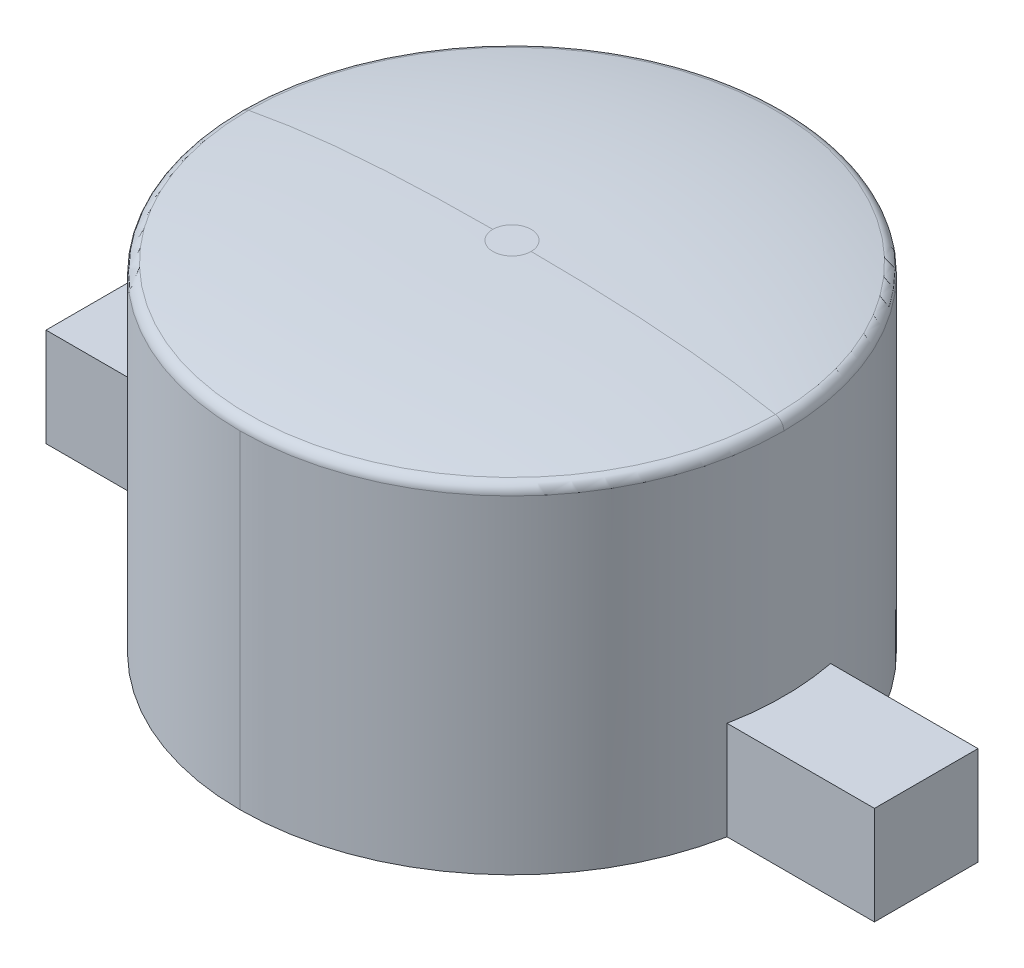
ISO-10303-21;
HEADER;
FILE_DESCRIPTION(('STEP AP214'),'2;1');
FILE_NAME('part.step','',(''),(''),'','','');
FILE_SCHEMA(('AUTOMOTIVE_DESIGN { 1 0 10303 214 1 1 1 1 }'));
ENDSEC;
DATA;
#1=APPLICATION_CONTEXT('core data for automotive mechanical design processes');
#2=APPLICATION_PROTOCOL_DEFINITION('international standard','automotive_design',2000,#1);
#3=PRODUCT_CONTEXT('',#1,'mechanical');
#4=PRODUCT('Part','Part','',(#3));
#5=PRODUCT_RELATED_PRODUCT_CATEGORY('part','',(#4));
#6=PRODUCT_DEFINITION_FORMATION('','',#4);
#7=PRODUCT_DEFINITION_CONTEXT('part definition',#1,'design');
#8=PRODUCT_DEFINITION('design','',#6,#7);
#9=PRODUCT_DEFINITION_SHAPE('','',#8);
#10=(LENGTH_UNIT() NAMED_UNIT(*) SI_UNIT(.MILLI.,.METRE.));
#11=(NAMED_UNIT(*) PLANE_ANGLE_UNIT() SI_UNIT($,.RADIAN.));
#12=(NAMED_UNIT(*) SI_UNIT($,.STERADIAN.) SOLID_ANGLE_UNIT());
#13=UNCERTAINTY_MEASURE_WITH_UNIT(LENGTH_MEASURE(1.E-05),#10,'distance_accuracy_value','');
#14=(GEOMETRIC_REPRESENTATION_CONTEXT(3) GLOBAL_UNCERTAINTY_ASSIGNED_CONTEXT((#13)) GLOBAL_UNIT_ASSIGNED_CONTEXT((#10,
#11,#12)) REPRESENTATION_CONTEXT('',''));
#15=CARTESIAN_POINT('',(0.,0.,0.));
#16=DIRECTION('',(0.,0.,1.));
#17=DIRECTION('',(1.,0.,0.));
#18=AXIS2_PLACEMENT_3D('',#15,#16,#17);
#19=CARTESIAN_POINT('',(0.,5.2,0.));
#20=DIRECTION('',(0.,1.,0.));
#21=DIRECTION('',(1.,0.,0.));
#22=AXIS2_PLACEMENT_3D('',#19,#20,#21);
#23=PLANE('',#22);
#24=CARTESIAN_POINT('',(0.,5.2,0.));
#25=DIRECTION('',(0.,-1.,0.));
#26=DIRECTION('',(0.,0.,-1.));
#27=AXIS2_PLACEMENT_3D('',#24,#25,#26);
#28=CIRCLE('',#27,0.95);
#29=CARTESIAN_POINT('',(0.,5.2,0.95));
#30=VERTEX_POINT('',#29);
#31=CARTESIAN_POINT('',(0.,5.2,-0.95));
#32=VERTEX_POINT('',#31);
#33=EDGE_CURVE('E471',#30,#32,#28,.T.);
#34=ORIENTED_EDGE('',*,*,#33,.T.);
#35=CARTESIAN_POINT('',(0.,5.2,0.));
#36=DIRECTION('',(0.,-1.,0.));
#37=DIRECTION('',(0.,0.,-1.));
#38=AXIS2_PLACEMENT_3D('',#35,#36,#37);
#39=CIRCLE('',#38,0.95);
#40=EDGE_CURVE('E11',#32,#30,#39,.T.);
#41=ORIENTED_EDGE('',*,*,#40,.T.);
#42=EDGE_LOOP('',(#34,#41));
#43=FACE_BOUND('',#42,.T.);
#44=ADVANCED_FACE('F17',(#43),#23,.F.);
#45=CARTESIAN_POINT('',(0.,2.5,0.));
#46=DIRECTION('',(0.,-1.,0.));
#47=DIRECTION('',(0.,0.,-1.));
#48=AXIS2_PLACEMENT_3D('',#45,#46,#47);
#49=PLANE('',#48);
#50=CARTESIAN_POINT('',(0.,2.5,0.));
#51=DIRECTION('',(0.,-1.,0.));
#52=DIRECTION('',(0.,0.,-1.));
#53=AXIS2_PLACEMENT_3D('',#50,#51,#52);
#54=CIRCLE('',#53,0.95);
#55=CARTESIAN_POINT('',(0.,2.5,0.95));
#56=VERTEX_POINT('',#55);
#57=CARTESIAN_POINT('',(0.,2.5,-0.95));
#58=VERTEX_POINT('',#57);
#59=EDGE_CURVE('E523',#56,#58,#54,.T.);
#60=ORIENTED_EDGE('',*,*,#59,.F.);
#61=CARTESIAN_POINT('',(0.,2.5,0.));
#62=DIRECTION('',(0.,-1.,0.));
#63=DIRECTION('',(0.,0.,-1.));
#64=AXIS2_PLACEMENT_3D('',#61,#62,#63);
#65=CIRCLE('',#64,0.95);
#66=EDGE_CURVE('E28',#58,#56,#65,.T.);
#67=ORIENTED_EDGE('',*,*,#66,.F.);
#68=EDGE_LOOP('',(#60,#67));
#69=FACE_BOUND('',#68,.T.);
#70=DIRECTION('',(1.,0.,0.));
#71=VECTOR('',#70,1.);
#72=CARTESIAN_POINT('',(0.,2.5,0.4));
#73=LINE('',#72,#71);
#74=CARTESIAN_POINT('',(1.95959179422654,2.5,0.4));
#75=VERTEX_POINT('',#74);
#76=CARTESIAN_POINT('',(3.62801598673435,2.5,0.4));
#77=VERTEX_POINT('',#76);
#78=EDGE_CURVE('E402',#75,#77,#73,.T.);
#79=ORIENTED_EDGE('',*,*,#78,.F.);
#80=CARTESIAN_POINT('',(0.,2.5,0.));
#81=DIRECTION('',(0.,-1.,0.));
#82=DIRECTION('',(0.,0.,-1.));
#83=AXIS2_PLACEMENT_3D('',#80,#81,#82);
#84=CIRCLE('',#83,2.);
#85=CARTESIAN_POINT('',(0.,2.5,2.));
#86=VERTEX_POINT('',#85);
#87=EDGE_CURVE('E406',#75,#86,#84,.T.);
#88=ORIENTED_EDGE('',*,*,#87,.T.);
#89=CARTESIAN_POINT('',(0.,2.5,0.));
#90=DIRECTION('',(0.,-1.,0.));
#91=DIRECTION('',(0.,0.,-1.));
#92=AXIS2_PLACEMENT_3D('',#89,#90,#91);
#93=CIRCLE('',#92,2.);
#94=CARTESIAN_POINT('',(-1.95959179422654,2.5,0.4));
#95=VERTEX_POINT('',#94);
#96=EDGE_CURVE('E522',#86,#95,#93,.T.);
#97=ORIENTED_EDGE('',*,*,#96,.T.);
#98=DIRECTION('',(1.,0.,0.));
#99=VECTOR('',#98,1.);
#100=CARTESIAN_POINT('',(0.,2.5,0.4));
#101=LINE('',#100,#99);
#102=CARTESIAN_POINT('',(-3.62801598673435,2.5,0.4));
#103=VERTEX_POINT('',#102);
#104=EDGE_CURVE('E340',#103,#95,#101,.T.);
#105=ORIENTED_EDGE('',*,*,#104,.F.);
#106=CARTESIAN_POINT('',(0.,2.5,0.));
#107=DIRECTION('',(0.,-1.,0.));
#108=DIRECTION('',(0.,0.,-1.));
#109=AXIS2_PLACEMENT_3D('',#106,#107,#108);
#110=CIRCLE('',#109,3.65);
#111=CARTESIAN_POINT('',(-3.62801598673435,2.5,-0.4));
#112=VERTEX_POINT('',#111);
#113=EDGE_CURVE('E433',#103,#112,#110,.T.);
#114=ORIENTED_EDGE('',*,*,#113,.T.);
#115=DIRECTION('',(1.,0.,0.));
#116=VECTOR('',#115,1.);
#117=CARTESIAN_POINT('',(0.,2.5,-0.4));
#118=LINE('',#117,#116);
#119=CARTESIAN_POINT('',(-1.95959179422654,2.5,-0.4));
#120=VERTEX_POINT('',#119);
#121=EDGE_CURVE('E339',#112,#120,#118,.T.);
#122=ORIENTED_EDGE('',*,*,#121,.T.);
#123=CARTESIAN_POINT('',(0.,2.5,0.));
#124=DIRECTION('',(0.,-1.,0.));
#125=DIRECTION('',(0.,0.,-1.));
#126=AXIS2_PLACEMENT_3D('',#123,#124,#125);
#127=CIRCLE('',#126,2.);
#128=CARTESIAN_POINT('',(-0.4,2.5,-1.95959179422654));
#129=VERTEX_POINT('',#128);
#130=EDGE_CURVE('E106',#120,#129,#127,.T.);
#131=ORIENTED_EDGE('',*,*,#130,.T.);
#132=DIRECTION('',(0.,0.,-1.));
#133=VECTOR('',#132,1.);
#134=CARTESIAN_POINT('',(-0.4,2.5,0.));
#135=LINE('',#134,#133);
#136=CARTESIAN_POINT('',(-0.4,2.5,-3.62801598673435));
#137=VERTEX_POINT('',#136);
#138=EDGE_CURVE('E93',#129,#137,#135,.T.);
#139=ORIENTED_EDGE('',*,*,#138,.T.);
#140=CARTESIAN_POINT('',(0.,2.5,0.));
#141=DIRECTION('',(0.,-1.,0.));
#142=DIRECTION('',(0.,0.,-1.));
#143=AXIS2_PLACEMENT_3D('',#140,#141,#142);
#144=CIRCLE('',#143,3.65);
#145=CARTESIAN_POINT('',(0.,2.5,-3.65));
#146=VERTEX_POINT('',#145);
#147=EDGE_CURVE('E297',#137,#146,#144,.T.);
#148=ORIENTED_EDGE('',*,*,#147,.T.);
#149=CARTESIAN_POINT('',(0.,2.5,0.));
#150=DIRECTION('',(0.,-1.,0.));
#151=DIRECTION('',(0.,0.,-1.));
#152=AXIS2_PLACEMENT_3D('',#149,#150,#151);
#153=CIRCLE('',#152,3.65);
#154=CARTESIAN_POINT('',(0.4,2.5,-3.62801598673435));
#155=VERTEX_POINT('',#154);
#156=EDGE_CURVE('E286',#146,#155,#153,.T.);
#157=ORIENTED_EDGE('',*,*,#156,.T.);
#158=DIRECTION('',(0.,0.,-1.));
#159=VECTOR('',#158,1.);
#160=CARTESIAN_POINT('',(0.4,2.5,0.));
#161=LINE('',#160,#159);
#162=CARTESIAN_POINT('',(0.4,2.5,-1.95959179422654));
#163=VERTEX_POINT('',#162);
#164=EDGE_CURVE('E351',#163,#155,#161,.T.);
#165=ORIENTED_EDGE('',*,*,#164,.F.);
#166=CARTESIAN_POINT('',(0.,2.5,0.));
#167=DIRECTION('',(0.,-1.,0.));
#168=DIRECTION('',(0.,0.,-1.));
#169=AXIS2_PLACEMENT_3D('',#166,#167,#168);
#170=CIRCLE('',#169,2.);
#171=CARTESIAN_POINT('',(1.95959179422654,2.5,-0.4));
#172=VERTEX_POINT('',#171);
#173=EDGE_CURVE('E21',#163,#172,#170,.T.);
#174=ORIENTED_EDGE('',*,*,#173,.T.);
#175=DIRECTION('',(1.,0.,0.));
#176=VECTOR('',#175,1.);
#177=CARTESIAN_POINT('',(0.,2.5,-0.4));
#178=LINE('',#177,#176);
#179=CARTESIAN_POINT('',(3.62801598673435,2.5,-0.4));
#180=VERTEX_POINT('',#179);
#181=EDGE_CURVE('E43',#172,#180,#178,.T.);
#182=ORIENTED_EDGE('',*,*,#181,.T.);
#183=CARTESIAN_POINT('',(0.,2.5,0.));
#184=DIRECTION('',(0.,-1.,0.));
#185=DIRECTION('',(0.,0.,-1.));
#186=AXIS2_PLACEMENT_3D('',#183,#184,#185);
#187=CIRCLE('',#186,3.65);
#188=EDGE_CURVE('E362',#180,#77,#187,.T.);
#189=ORIENTED_EDGE('',*,*,#188,.T.);
#190=EDGE_LOOP('',(#79,#88,#97,#105,#114,#122,#131,#139,#148,#157,#165,#174,#182,#189));
#191=FACE_BOUND('',#190,.T.);
#192=ADVANCED_FACE('F597',(#69,#191),#49,.T.);
#193=CARTESIAN_POINT('',(0.,2.5,0.));
#194=DIRECTION('',(0.,1.,0.));
#195=DIRECTION('',(0.,0.,1.));
#196=AXIS2_PLACEMENT_3D('',#193,#194,#195);
#197=CYLINDRICAL_SURFACE('',#196,0.95);
#198=DIRECTION('',(0.,1.,0.));
#199=VECTOR('',#198,1.);
#200=CARTESIAN_POINT('',(0.,2.5,-0.95));
#201=LINE('',#200,#199);
#202=EDGE_CURVE('E478',#58,#32,#201,.T.);
#203=ORIENTED_EDGE('',*,*,#202,.F.);
#204=ORIENTED_EDGE('',*,*,#66,.T.);
#205=DIRECTION('',(0.,1.,0.));
#206=VECTOR('',#205,1.);
#207=CARTESIAN_POINT('',(0.,2.5,0.95));
#208=LINE('',#207,#206);
#209=EDGE_CURVE('E477',#56,#30,#208,.T.);
#210=ORIENTED_EDGE('',*,*,#209,.T.);
#211=ORIENTED_EDGE('',*,*,#40,.F.);
#212=EDGE_LOOP('',(#203,#204,#210,#211));
#213=FACE_BOUND('',#212,.T.);
#214=ADVANCED_FACE('F687',(#213),#197,.F.);
#215=CARTESIAN_POINT('',(0.,2.5,-0.4));
#216=DIRECTION('',(0.,0.,1.));
#217=DIRECTION('',(1.,0.,0.));
#218=AXIS2_PLACEMENT_3D('',#215,#216,#217);
#219=PLANE('',#218);
#220=DIRECTION('',(1.,0.,0.));
#221=VECTOR('',#220,1.);
#222=CARTESIAN_POINT('',(0.,5.2,-0.4));
#223=LINE('',#222,#221);
#224=CARTESIAN_POINT('',(1.95959179422654,5.2,-0.4));
#225=VERTEX_POINT('',#224);
#226=CARTESIAN_POINT('',(3.62801598673435,5.2,-0.4));
#227=VERTEX_POINT('',#226);
#228=EDGE_CURVE('E418',#225,#227,#223,.T.);
#229=ORIENTED_EDGE('',*,*,#228,.T.);
#230=DIRECTION('',(0.,1.,0.));
#231=VECTOR('',#230,1.);
#232=CARTESIAN_POINT('',(3.62801598673435,2.5,-0.4));
#233=LINE('',#232,#231);
#234=EDGE_CURVE('E357',#180,#227,#233,.T.);
#235=ORIENTED_EDGE('',*,*,#234,.F.);
#236=ORIENTED_EDGE('',*,*,#181,.F.);
#237=DIRECTION('',(0.,1.,0.));
#238=VECTOR('',#237,1.);
#239=CARTESIAN_POINT('',(1.95959179422654,2.5,-0.4));
#240=LINE('',#239,#238);
#241=EDGE_CURVE('E363',#172,#225,#240,.T.);
#242=ORIENTED_EDGE('',*,*,#241,.T.);
#243=EDGE_LOOP('',(#229,#235,#236,#242));
#244=FACE_BOUND('',#243,.T.);
#245=ADVANCED_FACE('F657',(#244),#219,.F.);
#246=CARTESIAN_POINT('',(0.,2.5,0.));
#247=DIRECTION('',(0.,1.,0.));
#248=DIRECTION('',(0.,0.,1.));
#249=AXIS2_PLACEMENT_3D('',#246,#247,#248);
#250=CYLINDRICAL_SURFACE('',#249,2.);
#251=CARTESIAN_POINT('',(0.,5.2,0.));
#252=DIRECTION('',(0.,-1.,0.));
#253=DIRECTION('',(0.,0.,-1.));
#254=AXIS2_PLACEMENT_3D('',#251,#252,#253);
#255=CIRCLE('',#254,2.);
#256=CARTESIAN_POINT('',(0.4,5.2,-1.95959179422654));
#257=VERTEX_POINT('',#256);
#258=EDGE_CURVE('E428',#257,#225,#255,.T.);
#259=ORIENTED_EDGE('',*,*,#258,.T.);
#260=ORIENTED_EDGE('',*,*,#241,.F.);
#261=ORIENTED_EDGE('',*,*,#173,.F.);
#262=DIRECTION('',(0.,1.,0.));
#263=VECTOR('',#262,1.);
#264=CARTESIAN_POINT('',(0.4,2.5,-1.95959179422654));
#265=LINE('',#264,#263);
#266=EDGE_CURVE('E348',#163,#257,#265,.T.);
#267=ORIENTED_EDGE('',*,*,#266,.T.);
#268=EDGE_LOOP('',(#259,#260,#261,#267));
#269=FACE_BOUND('',#268,.T.);
#270=ADVANCED_FACE('F1067',(#269),#250,.T.);
#271=CARTESIAN_POINT('',(0.4,2.5,0.));
#272=DIRECTION('',(1.,0.,0.));
#273=DIRECTION('',(0.,0.,1.));
#274=AXIS2_PLACEMENT_3D('',#271,#272,#273);
#275=PLANE('',#274);
#276=DIRECTION('',(0.,0.,-1.));
#277=VECTOR('',#276,1.);
#278=CARTESIAN_POINT('',(0.4,5.2,0.));
#279=LINE('',#278,#277);
#280=CARTESIAN_POINT('',(0.4,5.2,-3.62801598673435));
#281=VERTEX_POINT('',#280);
#282=EDGE_CURVE('E425',#257,#281,#279,.T.);
#283=ORIENTED_EDGE('',*,*,#282,.F.);
#284=ORIENTED_EDGE('',*,*,#266,.F.);
#285=ORIENTED_EDGE('',*,*,#164,.T.);
#286=DIRECTION('',(0.,1.,0.));
#287=VECTOR('',#286,1.);
#288=CARTESIAN_POINT('',(0.4,2.5,-3.62801598673435));
#289=LINE('',#288,#287);
#290=EDGE_CURVE('E385',#155,#281,#289,.T.);
#291=ORIENTED_EDGE('',*,*,#290,.T.);
#292=EDGE_LOOP('',(#283,#284,#285,#291));
#293=FACE_BOUND('',#292,.T.);
#294=ADVANCED_FACE('F666',(#293),#275,.T.);
#295=CARTESIAN_POINT('',(-0.4,2.5,0.));
#296=DIRECTION('',(1.,0.,0.));
#297=DIRECTION('',(0.,0.,1.));
#298=AXIS2_PLACEMENT_3D('',#295,#296,#297);
#299=PLANE('',#298);
#300=DIRECTION('',(0.,0.,-1.));
#301=VECTOR('',#300,1.);
#302=CARTESIAN_POINT('',(-0.4,5.2,0.));
#303=LINE('',#302,#301);
#304=CARTESIAN_POINT('',(-0.4,5.2,-1.95959179422654));
#305=VERTEX_POINT('',#304);
#306=CARTESIAN_POINT('',(-0.4,5.2,-3.62801598673435));
#307=VERTEX_POINT('',#306);
#308=EDGE_CURVE('E394',#305,#307,#303,.T.);
#309=ORIENTED_EDGE('',*,*,#308,.T.);
#310=DIRECTION('',(0.,1.,0.));
#311=VECTOR('',#310,1.);
#312=CARTESIAN_POINT('',(-0.4,2.5,-3.62801598673435));
#313=LINE('',#312,#311);
#314=EDGE_CURVE('E325',#137,#307,#313,.T.);
#315=ORIENTED_EDGE('',*,*,#314,.F.);
#316=ORIENTED_EDGE('',*,*,#138,.F.);
#317=DIRECTION('',(0.,1.,0.));
#318=VECTOR('',#317,1.);
#319=CARTESIAN_POINT('',(-0.4,2.5,-1.95959179422654));
#320=LINE('',#319,#318);
#321=EDGE_CURVE('E536',#129,#305,#320,.T.);
#322=ORIENTED_EDGE('',*,*,#321,.T.);
#323=EDGE_LOOP('',(#309,#315,#316,#322));
#324=FACE_BOUND('',#323,.T.);
#325=ADVANCED_FACE('F669',(#324),#299,.F.);
#326=CARTESIAN_POINT('',(0.,2.5,0.));
#327=DIRECTION('',(0.,1.,0.));
#328=DIRECTION('',(0.,0.,1.));
#329=AXIS2_PLACEMENT_3D('',#326,#327,#328);
#330=CYLINDRICAL_SURFACE('',#329,2.);
#331=CARTESIAN_POINT('',(0.,5.2,0.));
#332=DIRECTION('',(0.,-1.,0.));
#333=DIRECTION('',(0.,0.,-1.));
#334=AXIS2_PLACEMENT_3D('',#331,#332,#333);
#335=CIRCLE('',#334,2.);
#336=CARTESIAN_POINT('',(-1.95959179422654,5.2,-0.4));
#337=VERTEX_POINT('',#336);
#338=EDGE_CURVE('E389',#337,#305,#335,.T.);
#339=ORIENTED_EDGE('',*,*,#338,.T.);
#340=ORIENTED_EDGE('',*,*,#321,.F.);
#341=ORIENTED_EDGE('',*,*,#130,.F.);
#342=DIRECTION('',(0.,1.,0.));
#343=VECTOR('',#342,1.);
#344=CARTESIAN_POINT('',(-1.95959179422654,2.5,-0.4));
#345=LINE('',#344,#343);
#346=EDGE_CURVE('E336',#120,#337,#345,.T.);
#347=ORIENTED_EDGE('',*,*,#346,.T.);
#348=EDGE_LOOP('',(#339,#340,#341,#347));
#349=FACE_BOUND('',#348,.T.);
#350=ADVANCED_FACE('F670',(#349),#330,.T.);
#351=CARTESIAN_POINT('',(0.,2.5,-0.4));
#352=DIRECTION('',(0.,0.,1.));
#353=DIRECTION('',(1.,0.,0.));
#354=AXIS2_PLACEMENT_3D('',#351,#352,#353);
#355=PLANE('',#354);
#356=DIRECTION('',(1.,0.,0.));
#357=VECTOR('',#356,1.);
#358=CARTESIAN_POINT('',(0.,5.2,-0.4));
#359=LINE('',#358,#357);
#360=CARTESIAN_POINT('',(-3.62801598673435,5.2,-0.4));
#361=VERTEX_POINT('',#360);
#362=EDGE_CURVE('E285',#361,#337,#359,.T.);
#363=ORIENTED_EDGE('',*,*,#362,.T.);
#364=ORIENTED_EDGE('',*,*,#346,.F.);
#365=ORIENTED_EDGE('',*,*,#121,.F.);
#366=DIRECTION('',(0.,1.,0.));
#367=VECTOR('',#366,1.);
#368=CARTESIAN_POINT('',(-3.62801598673435,2.5,-0.4));
#369=LINE('',#368,#367);
#370=EDGE_CURVE('E429',#112,#361,#369,.T.);
#371=ORIENTED_EDGE('',*,*,#370,.T.);
#372=EDGE_LOOP('',(#363,#364,#365,#371));
#373=FACE_BOUND('',#372,.T.);
#374=ADVANCED_FACE('F644',(#373),#355,.F.);
#375=CARTESIAN_POINT('',(0.,2.5,0.4));
#376=DIRECTION('',(0.,0.,1.));
#377=DIRECTION('',(1.,0.,0.));
#378=AXIS2_PLACEMENT_3D('',#375,#376,#377);
#379=PLANE('',#378);
#380=DIRECTION('',(1.,0.,0.));
#381=VECTOR('',#380,1.);
#382=CARTESIAN_POINT('',(0.,5.2,0.4));
#383=LINE('',#382,#381);
#384=CARTESIAN_POINT('',(-3.62801598673435,5.2,0.4));
#385=VERTEX_POINT('',#384);
#386=CARTESIAN_POINT('',(-1.95959179422654,5.2,0.4));
#387=VERTEX_POINT('',#386);
#388=EDGE_CURVE('E482',#385,#387,#383,.T.);
#389=ORIENTED_EDGE('',*,*,#388,.F.);
#390=DIRECTION('',(0.,1.,0.));
#391=VECTOR('',#390,1.);
#392=CARTESIAN_POINT('',(-3.62801598673435,2.5,0.4));
#393=LINE('',#392,#391);
#394=EDGE_CURVE('E464',#103,#385,#393,.T.);
#395=ORIENTED_EDGE('',*,*,#394,.F.);
#396=ORIENTED_EDGE('',*,*,#104,.T.);
#397=DIRECTION('',(0.,1.,0.));
#398=VECTOR('',#397,1.);
#399=CARTESIAN_POINT('',(-1.95959179422654,2.5,0.4));
#400=LINE('',#399,#398);
#401=EDGE_CURVE('E383',#95,#387,#400,.T.);
#402=ORIENTED_EDGE('',*,*,#401,.T.);
#403=EDGE_LOOP('',(#389,#395,#396,#402));
#404=FACE_BOUND('',#403,.T.);
#405=ADVANCED_FACE('F588',(#404),#379,.T.);
#406=CARTESIAN_POINT('',(0.,2.5,0.));
#407=DIRECTION('',(0.,1.,0.));
#408=DIRECTION('',(0.,0.,1.));
#409=AXIS2_PLACEMENT_3D('',#406,#407,#408);
#410=CYLINDRICAL_SURFACE('',#409,2.);
#411=DIRECTION('',(0.,1.,0.));
#412=VECTOR('',#411,1.);
#413=CARTESIAN_POINT('',(0.,2.5,2.));
#414=LINE('',#413,#412);
#415=CARTESIAN_POINT('',(0.,5.2,2.));
#416=VERTEX_POINT('',#415);
#417=EDGE_CURVE('E384',#86,#416,#414,.T.);
#418=ORIENTED_EDGE('',*,*,#417,.F.);
#419=ORIENTED_EDGE('',*,*,#87,.F.);
#420=DIRECTION('',(0.,1.,0.));
#421=VECTOR('',#420,1.);
#422=CARTESIAN_POINT('',(1.95959179422654,2.5,0.4));
#423=LINE('',#422,#421);
#424=CARTESIAN_POINT('',(1.95959179422654,5.2,0.4));
#425=VERTEX_POINT('',#424);
#426=EDGE_CURVE('E399',#75,#425,#423,.T.);
#427=ORIENTED_EDGE('',*,*,#426,.T.);
#428=CARTESIAN_POINT('',(0.,5.2,0.));
#429=DIRECTION('',(0.,-1.,0.));
#430=DIRECTION('',(0.,0.,-1.));
#431=AXIS2_PLACEMENT_3D('',#428,#429,#430);
#432=CIRCLE('',#431,2.);
#433=EDGE_CURVE('E393',#425,#416,#432,.T.);
#434=ORIENTED_EDGE('',*,*,#433,.T.);
#435=EDGE_LOOP('',(#418,#419,#427,#434));
#436=FACE_BOUND('',#435,.T.);
#437=ADVANCED_FACE('F1057',(#436),#410,.T.);
#438=CARTESIAN_POINT('',(0.,2.5,0.4));
#439=DIRECTION('',(0.,0.,1.));
#440=DIRECTION('',(1.,0.,0.));
#441=AXIS2_PLACEMENT_3D('',#438,#439,#440);
#442=PLANE('',#441);
#443=DIRECTION('',(1.,0.,0.));
#444=VECTOR('',#443,1.);
#445=CARTESIAN_POINT('',(0.,5.2,0.4));
#446=LINE('',#445,#444);
#447=CARTESIAN_POINT('',(3.62801598673435,5.2,0.4));
#448=VERTEX_POINT('',#447);
#449=EDGE_CURVE('E410',#425,#448,#446,.T.);
#450=ORIENTED_EDGE('',*,*,#449,.F.);
#451=ORIENTED_EDGE('',*,*,#426,.F.);
#452=ORIENTED_EDGE('',*,*,#78,.T.);
#453=DIRECTION('',(0.,1.,0.));
#454=VECTOR('',#453,1.);
#455=CARTESIAN_POINT('',(3.62801598673435,2.5,0.4));
#456=LINE('',#455,#454);
#457=EDGE_CURVE('E420',#77,#448,#456,.T.);
#458=ORIENTED_EDGE('',*,*,#457,.T.);
#459=EDGE_LOOP('',(#450,#451,#452,#458));
#460=FACE_BOUND('',#459,.T.);
#461=ADVANCED_FACE('F653',(#460),#442,.T.);
#462=CARTESIAN_POINT('',(0.,1.9,0.));
#463=DIRECTION('',(0.,-1.,0.));
#464=DIRECTION('',(0.,0.,-1.));
#465=AXIS2_PLACEMENT_3D('',#462,#463,#464);
#466=PLANE('',#465);
#467=DIRECTION('',(0.,0.,-1.));
#468=VECTOR('',#467,1.);
#469=CARTESIAN_POINT('',(8.,1.9,0.));
#470=LINE('',#469,#468);
#471=CARTESIAN_POINT('',(8.,1.9,1.));
#472=VERTEX_POINT('',#471);
#473=CARTESIAN_POINT('',(8.,1.9,-1.));
#474=VERTEX_POINT('',#473);
#475=EDGE_CURVE('E356',#472,#474,#470,.T.);
#476=ORIENTED_EDGE('',*,*,#475,.T.);
#477=DIRECTION('',(1.,0.,0.));
#478=VECTOR('',#477,1.);
#479=CARTESIAN_POINT('',(0.,1.9,-1.));
#480=LINE('',#479,#478);
#481=CARTESIAN_POINT('',(5.15388203202208,1.9,-1.));
#482=VERTEX_POINT('',#481);
#483=EDGE_CURVE('E355',#482,#474,#480,.T.);
#484=ORIENTED_EDGE('',*,*,#483,.F.);
#485=CARTESIAN_POINT('',(0.,1.9,0.));
#486=DIRECTION('',(0.,-1.,0.));
#487=DIRECTION('',(0.,0.,-1.));
#488=AXIS2_PLACEMENT_3D('',#485,#486,#487);
#489=CIRCLE('',#488,5.25);
#490=CARTESIAN_POINT('',(5.15388203202208,1.9,1.));
#491=VERTEX_POINT('',#490);
#492=EDGE_CURVE('E366',#482,#491,#489,.T.);
#493=ORIENTED_EDGE('',*,*,#492,.T.);
#494=DIRECTION('',(1.,0.,0.));
#495=VECTOR('',#494,1.);
#496=CARTESIAN_POINT('',(0.,1.9,1.));
#497=LINE('',#496,#495);
#498=EDGE_CURVE('E403',#491,#472,#497,.T.);
#499=ORIENTED_EDGE('',*,*,#498,.T.);
#500=EDGE_LOOP('',(#476,#484,#493,#499));
#501=FACE_BOUND('',#500,.T.);
#502=ADVANCED_FACE('F1042',(#501),#466,.F.);
#503=CARTESIAN_POINT('',(0.,1.9,1.));
#504=DIRECTION('',(0.,0.,-1.));
#505=DIRECTION('',(0.,-1.,0.));
#506=AXIS2_PLACEMENT_3D('',#503,#504,#505);
#507=PLANE('',#506);
#508=DIRECTION('',(1.,0.,0.));
#509=VECTOR('',#508,1.);
#510=CARTESIAN_POINT('',(0.,0.,1.));
#511=LINE('',#510,#509);
#512=CARTESIAN_POINT('',(5.15388203202208,0.,1.));
#513=VERTEX_POINT('',#512);
#514=CARTESIAN_POINT('',(8.,0.,1.));
#515=VERTEX_POINT('',#514);
#516=EDGE_CURVE('E514',#513,#515,#511,.T.);
#517=ORIENTED_EDGE('',*,*,#516,.T.);
#518=DIRECTION('',(0.,-1.,0.));
#519=VECTOR('',#518,1.);
#520=CARTESIAN_POINT('',(8.,1.9,1.));
#521=LINE('',#520,#519);
#522=EDGE_CURVE('E352',#472,#515,#521,.T.);
#523=ORIENTED_EDGE('',*,*,#522,.F.);
#524=ORIENTED_EDGE('',*,*,#498,.F.);
#525=DIRECTION('',(0.,-1.,0.));
#526=VECTOR('',#525,1.);
#527=CARTESIAN_POINT('',(5.15388203202208,1.9,1.));
#528=LINE('',#527,#526);
#529=EDGE_CURVE('E324',#491,#513,#528,.T.);
#530=ORIENTED_EDGE('',*,*,#529,.T.);
#531=EDGE_LOOP('',(#517,#523,#524,#530));
#532=FACE_BOUND('',#531,.T.);
#533=ADVANCED_FACE('F1003',(#532),#507,.F.);
#534=CARTESIAN_POINT('',(0.,1.9,-1.));
#535=DIRECTION('',(0.,0.,-1.));
#536=DIRECTION('',(0.,-1.,0.));
#537=AXIS2_PLACEMENT_3D('',#534,#535,#536);
#538=PLANE('',#537);
#539=DIRECTION('',(1.,0.,0.));
#540=VECTOR('',#539,1.);
#541=CARTESIAN_POINT('',(0.,0.,-1.));
#542=LINE('',#541,#540);
#543=CARTESIAN_POINT('',(5.15388203202208,0.,-1.));
#544=VERTEX_POINT('',#543);
#545=CARTESIAN_POINT('',(8.,0.,-1.));
#546=VERTEX_POINT('',#545);
#547=EDGE_CURVE('E490',#544,#546,#542,.T.);
#548=ORIENTED_EDGE('',*,*,#547,.F.);
#549=DIRECTION('',(0.,-1.,0.));
#550=VECTOR('',#549,1.);
#551=CARTESIAN_POINT('',(5.15388203202208,1.9,-1.));
#552=LINE('',#551,#550);
#553=EDGE_CURVE('E370',#482,#544,#552,.T.);
#554=ORIENTED_EDGE('',*,*,#553,.F.);
#555=ORIENTED_EDGE('',*,*,#483,.T.);
#556=DIRECTION('',(0.,-1.,0.));
#557=VECTOR('',#556,1.);
#558=CARTESIAN_POINT('',(8.,1.9,-1.));
#559=LINE('',#558,#557);
#560=EDGE_CURVE('E395',#474,#546,#559,.T.);
#561=ORIENTED_EDGE('',*,*,#560,.T.);
#562=EDGE_LOOP('',(#548,#554,#555,#561));
#563=FACE_BOUND('',#562,.T.);
#564=ADVANCED_FACE('F999',(#563),#538,.T.);
#565=CARTESIAN_POINT('',(8.,1.9,0.));
#566=DIRECTION('',(-1.,0.,0.));
#567=DIRECTION('',(0.,0.,1.));
#568=AXIS2_PLACEMENT_3D('',#565,#566,#567);
#569=PLANE('',#568);
#570=DIRECTION('',(0.,0.,-1.));
#571=VECTOR('',#570,1.);
#572=CARTESIAN_POINT('',(8.,0.,0.));
#573=LINE('',#572,#571);
#574=EDGE_CURVE('E499',#515,#546,#573,.T.);
#575=ORIENTED_EDGE('',*,*,#574,.T.);
#576=ORIENTED_EDGE('',*,*,#560,.F.);
#577=ORIENTED_EDGE('',*,*,#475,.F.);
#578=ORIENTED_EDGE('',*,*,#522,.T.);
#579=EDGE_LOOP('',(#575,#576,#577,#578));
#580=FACE_BOUND('',#579,.T.);
#581=ADVANCED_FACE('F19',(#580),#569,.F.);
#582=CARTESIAN_POINT('',(0.,1.9,0.));
#583=DIRECTION('',(0.,-1.,0.));
#584=DIRECTION('',(0.,0.,-1.));
#585=AXIS2_PLACEMENT_3D('',#582,#583,#584);
#586=PLANE('',#585);
#587=DIRECTION('',(-1.,0.,0.));
#588=VECTOR('',#587,1.);
#589=CARTESIAN_POINT('',(0.,1.9,1.));
#590=LINE('',#589,#588);
#591=CARTESIAN_POINT('',(-5.15388203202208,1.9,1.));
#592=VERTEX_POINT('',#591);
#593=CARTESIAN_POINT('',(-8.,1.9,1.));
#594=VERTEX_POINT('',#593);
#595=EDGE_CURVE('E530',#592,#594,#590,.T.);
#596=ORIENTED_EDGE('',*,*,#595,.F.);
#597=CARTESIAN_POINT('',(0.,1.9,0.));
#598=DIRECTION('',(0.,-1.,0.));
#599=DIRECTION('',(0.,0.,-1.));
#600=AXIS2_PLACEMENT_3D('',#597,#598,#599);
#601=CIRCLE('',#600,5.25);
#602=CARTESIAN_POINT('',(-5.15388203202208,1.9,-1.));
#603=VERTEX_POINT('',#602);
#604=EDGE_CURVE('E334',#592,#603,#601,.T.);
#605=ORIENTED_EDGE('',*,*,#604,.T.);
#606=DIRECTION('',(-1.,0.,0.));
#607=VECTOR('',#606,1.);
#608=CARTESIAN_POINT('',(0.,1.9,-1.));
#609=LINE('',#608,#607);
#610=CARTESIAN_POINT('',(-8.,1.9,-1.));
#611=VERTEX_POINT('',#610);
#612=EDGE_CURVE('E377',#603,#611,#609,.T.);
#613=ORIENTED_EDGE('',*,*,#612,.T.);
#614=DIRECTION('',(0.,0.,-1.));
#615=VECTOR('',#614,1.);
#616=CARTESIAN_POINT('',(-8.,1.9,0.));
#617=LINE('',#616,#615);
#618=EDGE_CURVE('E398',#594,#611,#617,.T.);
#619=ORIENTED_EDGE('',*,*,#618,.F.);
#620=EDGE_LOOP('',(#596,#605,#613,#619));
#621=FACE_BOUND('',#620,.T.);
#622=ADVANCED_FACE('F696',(#621),#586,.F.);
#623=CARTESIAN_POINT('',(-8.,1.9,0.));
#624=DIRECTION('',(-1.,0.,0.));
#625=DIRECTION('',(0.,0.,1.));
#626=AXIS2_PLACEMENT_3D('',#623,#624,#625);
#627=PLANE('',#626);
#628=DIRECTION('',(0.,0.,-1.));
#629=VECTOR('',#628,1.);
#630=CARTESIAN_POINT('',(-8.,0.,0.));
#631=LINE('',#630,#629);
#632=CARTESIAN_POINT('',(-8.,0.,1.));
#633=VERTEX_POINT('',#632);
#634=CARTESIAN_POINT('',(-8.,0.,-1.));
#635=VERTEX_POINT('',#634);
#636=EDGE_CURVE('E440',#633,#635,#631,.T.);
#637=ORIENTED_EDGE('',*,*,#636,.F.);
#638=DIRECTION('',(0.,-1.,0.));
#639=VECTOR('',#638,1.);
#640=CARTESIAN_POINT('',(-8.,1.9,1.));
#641=LINE('',#640,#639);
#642=EDGE_CURVE('E378',#594,#633,#641,.T.);
#643=ORIENTED_EDGE('',*,*,#642,.F.);
#644=ORIENTED_EDGE('',*,*,#618,.T.);
#645=DIRECTION('',(0.,-1.,0.));
#646=VECTOR('',#645,1.);
#647=CARTESIAN_POINT('',(-8.,1.9,-1.));
#648=LINE('',#647,#646);
#649=EDGE_CURVE('E374',#611,#635,#648,.T.);
#650=ORIENTED_EDGE('',*,*,#649,.T.);
#651=EDGE_LOOP('',(#637,#643,#644,#650));
#652=FACE_BOUND('',#651,.T.);
#653=ADVANCED_FACE('F693',(#652),#627,.T.);
#654=CARTESIAN_POINT('',(0.,1.9,-1.));
#655=DIRECTION('',(0.,0.,1.));
#656=DIRECTION('',(1.,0.,0.));
#657=AXIS2_PLACEMENT_3D('',#654,#655,#656);
#658=PLANE('',#657);
#659=DIRECTION('',(-1.,0.,0.));
#660=VECTOR('',#659,1.);
#661=CARTESIAN_POINT('',(0.,0.,-1.));
#662=LINE('',#661,#660);
#663=CARTESIAN_POINT('',(-5.15388203202208,0.,-1.));
#664=VERTEX_POINT('',#663);
#665=EDGE_CURVE('E487',#664,#635,#662,.T.);
#666=ORIENTED_EDGE('',*,*,#665,.T.);
#667=ORIENTED_EDGE('',*,*,#649,.F.);
#668=ORIENTED_EDGE('',*,*,#612,.F.);
#669=DIRECTION('',(0.,-1.,0.));
#670=VECTOR('',#669,1.);
#671=CARTESIAN_POINT('',(-5.15388203202208,1.9,-1.));
#672=LINE('',#671,#670);
#673=EDGE_CURVE('E330',#603,#664,#672,.T.);
#674=ORIENTED_EDGE('',*,*,#673,.T.);
#675=EDGE_LOOP('',(#666,#667,#668,#674));
#676=FACE_BOUND('',#675,.T.);
#677=ADVANCED_FACE('F695',(#676),#658,.F.);
#678=CARTESIAN_POINT('',(0.,1.9,1.));
#679=DIRECTION('',(0.,0.,1.));
#680=DIRECTION('',(1.,0.,0.));
#681=AXIS2_PLACEMENT_3D('',#678,#679,#680);
#682=PLANE('',#681);
#683=DIRECTION('',(-1.,0.,0.));
#684=VECTOR('',#683,1.);
#685=CARTESIAN_POINT('',(0.,0.,1.));
#686=LINE('',#685,#684);
#687=CARTESIAN_POINT('',(-5.15388203202208,0.,1.));
#688=VERTEX_POINT('',#687);
#689=EDGE_CURVE('E344',#688,#633,#686,.T.);
#690=ORIENTED_EDGE('',*,*,#689,.F.);
#691=DIRECTION('',(0.,-1.,0.));
#692=VECTOR('',#691,1.);
#693=CARTESIAN_POINT('',(-5.15388203202208,1.9,1.));
#694=LINE('',#693,#692);
#695=EDGE_CURVE('E345',#592,#688,#694,.T.);
#696=ORIENTED_EDGE('',*,*,#695,.F.);
#697=ORIENTED_EDGE('',*,*,#595,.T.);
#698=ORIENTED_EDGE('',*,*,#642,.T.);
#699=EDGE_LOOP('',(#690,#696,#697,#698));
#700=FACE_BOUND('',#699,.T.);
#701=ADVANCED_FACE('F702',(#700),#682,.T.);
#702=CARTESIAN_POINT('',(0.,6.33616919152303,0.));
#703=DIRECTION('',(0.,1.,0.));
#704=DIRECTION('',(-1.,0.,0.));
#705=AXIS2_PLACEMENT_3D('',#702,#703,#704);
#706=TOROIDAL_SURFACE('',#705,5.05,0.2);
#707=CARTESIAN_POINT('',(5.05,6.33616919152303,0.));
#708=DIRECTION('',(0.,0.,1.));
#709=DIRECTION('',(1.,0.,0.));
#710=AXIS2_PLACEMENT_3D('',#707,#708,#709);
#711=CIRCLE('',#710,0.2);
#712=CARTESIAN_POINT('',(5.25,6.33616919152303,0.));
#713=VERTEX_POINT('',#712);
#714=CARTESIAN_POINT('',(5.08820757654808,6.53248572443436,0.));
#715=VERTEX_POINT('',#714);
#716=EDGE_CURVE('E411',#713,#715,#711,.T.);
#717=ORIENTED_EDGE('',*,*,#716,.F.);
#718=CARTESIAN_POINT('',(0.,6.33616919152303,0.));
#719=DIRECTION('',(0.,-1.,0.));
#720=DIRECTION('',(-1.,0.,0.));
#721=AXIS2_PLACEMENT_3D('',#718,#719,#720);
#722=CIRCLE('',#721,5.25);
#723=CARTESIAN_POINT('',(0.,6.33616919152303,-5.25));
#724=VERTEX_POINT('',#723);
#725=EDGE_CURVE('E318',#724,#713,#722,.T.);
#726=ORIENTED_EDGE('',*,*,#725,.F.);
#727=CARTESIAN_POINT('',(0.,6.33616919152303,0.));
#728=DIRECTION('',(0.,-1.,0.));
#729=DIRECTION('',(-1.,0.,0.));
#730=AXIS2_PLACEMENT_3D('',#727,#728,#729);
#731=CIRCLE('',#730,5.25);
#732=CARTESIAN_POINT('',(-5.25,6.33616919152303,0.));
#733=VERTEX_POINT('',#732);
#734=EDGE_CURVE('E416',#733,#724,#731,.T.);
#735=ORIENTED_EDGE('',*,*,#734,.F.);
#736=CARTESIAN_POINT('',(-5.05,6.33616919152303,0.));
#737=DIRECTION('',(0.,0.,-1.));
#738=DIRECTION('',(-1.,0.,0.));
#739=AXIS2_PLACEMENT_3D('',#736,#737,#738);
#740=CIRCLE('',#739,0.2);
#741=CARTESIAN_POINT('',(-5.08820757654808,6.53248572443436,0.));
#742=VERTEX_POINT('',#741);
#743=EDGE_CURVE('E319',#733,#742,#740,.T.);
#744=ORIENTED_EDGE('',*,*,#743,.T.);
#745=CARTESIAN_POINT('',(0.,6.53248572443436,0.));
#746=DIRECTION('',(0.,1.,0.));
#747=DIRECTION('',(1.,0.,0.));
#748=AXIS2_PLACEMENT_3D('',#745,#746,#747);
#749=CIRCLE('',#748,5.08820757654808);
#750=EDGE_CURVE('E518',#715,#742,#749,.T.);
#751=ORIENTED_EDGE('',*,*,#750,.F.);
#752=EDGE_LOOP('',(#717,#726,#735,#744,#751));
#753=FACE_BOUND('',#752,.T.);
#754=ADVANCED_FACE('F732',(#753),#706,.T.);
#755=CARTESIAN_POINT('',(0.,6.9,0.));
#756=DIRECTION('',(0.,1.,0.));
#757=DIRECTION('',(1.,0.,0.));
#758=AXIS2_PLACEMENT_3D('',#755,#756,#757);
#759=PLANE('',#758);
#760=CARTESIAN_POINT('',(0.,6.9,0.));
#761=DIRECTION('',(0.,-1.,0.));
#762=DIRECTION('',(1.,0.,0.));
#763=AXIS2_PLACEMENT_3D('',#760,#761,#762);
#764=CIRCLE('',#763,0.369960027986263);
#765=CARTESIAN_POINT('',(-0.369960027986263,6.9,0.));
#766=VERTEX_POINT('',#765);
#767=CARTESIAN_POINT('',(0.369960027986263,6.9,0.));
#768=VERTEX_POINT('',#767);
#769=EDGE_CURVE('E527',#766,#768,#764,.T.);
#770=ORIENTED_EDGE('',*,*,#769,.F.);
#771=CARTESIAN_POINT('',(0.,6.9,0.));
#772=DIRECTION('',(0.,-1.,0.));
#773=DIRECTION('',(1.,0.,0.));
#774=AXIS2_PLACEMENT_3D('',#771,#772,#773);
#775=CIRCLE('',#774,0.369960027986263);
#776=EDGE_CURVE('E449',#768,#766,#775,.T.);
#777=ORIENTED_EDGE('',*,*,#776,.F.);
#778=EDGE_LOOP('',(#770,#777));
#779=FACE_BOUND('',#778,.T.);
#780=ADVANCED_FACE('F902',(#779),#759,.T.);
#781=CARTESIAN_POINT('',(-5.08820757654808,6.53248572443436,0.));
#782=CARTESIAN_POINT('',(-5.08820757654808,6.53248572443436,-10.1764151530961));
#783=CARTESIAN_POINT('',(5.08820757654808,6.53248572443436,-10.1764151530961));
#784=CARTESIAN_POINT('',(5.08820757654808,6.53248572443436,0.));
#785=CARTESIAN_POINT('',(-3.80435472901905,6.78235212753856,0.));
#786=CARTESIAN_POINT('',(-3.80435472901905,6.78235212753856,-7.60870945803808));
#787=CARTESIAN_POINT('',(3.80435472901904,6.78235212753856,-7.6087094580381));
#788=CARTESIAN_POINT('',(3.80435472901905,6.78235212753856,0.));
#789=CARTESIAN_POINT('',(-2.28127540650463,6.8933948877201,0.));
#790=CARTESIAN_POINT('',(-2.28127540650464,6.8933948877201,-4.56255081300927));
#791=CARTESIAN_POINT('',(2.28127540650464,6.8933948877201,-4.56255081300927));
#792=CARTESIAN_POINT('',(2.28127540650463,6.8933948877201,0.));
#793=CARTESIAN_POINT('',(-0.369960028019836,6.90000000971512,0.));
#794=CARTESIAN_POINT('',(-0.369960028019835,6.90000000971512,-0.739920056039671));
#795=CARTESIAN_POINT('',(0.369960028019835,6.90000000971512,-0.739920056039671));
#796=CARTESIAN_POINT('',(0.369960028019836,6.90000000971512,0.));
#797=(BOUNDED_SURFACE() B_SPLINE_SURFACE(3,3,((#781,#782,#783,#784),(#785,#786,#787,#788),(#789,
#790,#791,#792),(#793,#794,#795,#796)),.UNSPECIFIED.,.F.,.F.,
.F.) B_SPLINE_SURFACE_WITH_KNOTS((4,4),(4,4),(0.0382793715893655,0.942415282570545),(0.,1.),
.UNSPECIFIED.) GEOMETRIC_REPRESENTATION_ITEM() RATIONAL_B_SPLINE_SURFACE(((1.,0.333333333333334,
0.333333333333334,1.),(1.,0.333333333333334,0.333333333333334,1.),(1.,0.333333333333334,
0.333333333333334,1.),(1.,0.333333333333334,0.333333333333334,1.))) REPRESENTATION_ITEM('') SURFACE());
#798=CARTESIAN_POINT('',(5.08820757654808,6.53248572443436,0.));
#799=CARTESIAN_POINT('',(3.80435472901887,6.78235212753857,0.));
#800=CARTESIAN_POINT('',(2.28127540650452,6.8933948877201,0.));
#801=CARTESIAN_POINT('',(0.369960027986263,6.9,0.));
#802=(BOUNDED_CURVE() B_SPLINE_CURVE(3,(#798,#799,#800,#801),.UNSPECIFIED.,.F.,
.F.) B_SPLINE_CURVE_WITH_KNOTS((4,4),(0.0382793715894174,0.942415282570545),
.UNSPECIFIED.) CURVE() GEOMETRIC_REPRESENTATION_ITEM() RATIONAL_B_SPLINE_CURVE((1.,1.,1.,1.)) REPRESENTATION_ITEM(''));
#803=EDGE_CURVE('E454',#715,#768,#802,.T.);
#804=CARTESIAN_POINT('',(-5.08820757654808,6.53248572443436,0.));
#805=CARTESIAN_POINT('',(-3.80435472901887,6.78235212753857,0.));
#806=CARTESIAN_POINT('',(-2.28127540650452,6.8933948877201,0.));
#807=CARTESIAN_POINT('',(-0.369960027986263,6.9,0.));
#808=(BOUNDED_CURVE() B_SPLINE_CURVE(3,(#804,#805,#806,#807),.UNSPECIFIED.,.F.,
.F.) B_SPLINE_CURVE_WITH_KNOTS((4,4),(0.0382793715894174,0.942415282570545),
.UNSPECIFIED.) CURVE() GEOMETRIC_REPRESENTATION_ITEM() RATIONAL_B_SPLINE_CURVE((1.,1.,1.,1.)) REPRESENTATION_ITEM(''));
#809=EDGE_CURVE('E453',#742,#766,#808,.T.);
#810=ORIENTED_EDGE('',*,*,#803,.F.);
#811=ORIENTED_EDGE('',*,*,#750,.T.);
#812=ORIENTED_EDGE('',*,*,#809,.T.);
#813=ORIENTED_EDGE('',*,*,#769,.T.);
#814=EDGE_LOOP('',(#810,#811,#812,#813));
#815=FACE_BOUND('',#814,.T.);
#816=ADVANCED_FACE('F727',(#815),#797,.T.);
#817=CARTESIAN_POINT('',(0.,0.,0.));
#818=DIRECTION('',(0.,1.,0.));
#819=DIRECTION('',(1.,0.,0.));
#820=AXIS2_PLACEMENT_3D('',#817,#818,#819);
#821=PLANE('',#820);
#822=CARTESIAN_POINT('',(0.,0.,0.));
#823=DIRECTION('',(0.,1.,0.));
#824=DIRECTION('',(0.,0.,1.));
#825=AXIS2_PLACEMENT_3D('',#822,#823,#824);
#826=CIRCLE('',#825,3.65);
#827=CARTESIAN_POINT('',(0.,0.,-3.65));
#828=VERTEX_POINT('',#827);
#829=CARTESIAN_POINT('',(0.,0.,3.65));
#830=VERTEX_POINT('',#829);
#831=EDGE_CURVE('E280',#828,#830,#826,.T.);
#832=ORIENTED_EDGE('',*,*,#831,.T.);
#833=CARTESIAN_POINT('',(0.,0.,0.));
#834=DIRECTION('',(0.,1.,0.));
#835=DIRECTION('',(0.,0.,1.));
#836=AXIS2_PLACEMENT_3D('',#833,#834,#835);
#837=CIRCLE('',#836,3.65);
#838=EDGE_CURVE('E275',#830,#828,#837,.T.);
#839=ORIENTED_EDGE('',*,*,#838,.T.);
#840=EDGE_LOOP('',(#832,#839));
#841=FACE_BOUND('',#840,.T.);
#842=CARTESIAN_POINT('',(0.,0.,0.));
#843=DIRECTION('',(0.,1.,0.));
#844=DIRECTION('',(0.,0.,1.));
#845=AXIS2_PLACEMENT_3D('',#842,#843,#844);
#846=CIRCLE('',#845,5.25);
#847=CARTESIAN_POINT('',(0.,0.,5.25));
#848=VERTEX_POINT('',#847);
#849=EDGE_CURVE('E341',#688,#848,#846,.T.);
#850=ORIENTED_EDGE('',*,*,#849,.F.);
#851=ORIENTED_EDGE('',*,*,#689,.T.);
#852=ORIENTED_EDGE('',*,*,#636,.T.);
#853=ORIENTED_EDGE('',*,*,#665,.F.);
#854=CARTESIAN_POINT('',(0.,0.,0.));
#855=DIRECTION('',(0.,1.,0.));
#856=DIRECTION('',(0.,0.,1.));
#857=AXIS2_PLACEMENT_3D('',#854,#855,#856);
#858=CIRCLE('',#857,5.25);
#859=CARTESIAN_POINT('',(0.,0.,-5.25));
#860=VERTEX_POINT('',#859);
#861=EDGE_CURVE('E335',#860,#664,#858,.T.);
#862=ORIENTED_EDGE('',*,*,#861,.F.);
#863=CARTESIAN_POINT('',(0.,0.,0.));
#864=DIRECTION('',(0.,1.,0.));
#865=DIRECTION('',(0.,0.,1.));
#866=AXIS2_PLACEMENT_3D('',#863,#864,#865);
#867=CIRCLE('',#866,5.25);
#868=EDGE_CURVE('E513',#544,#860,#867,.T.);
#869=ORIENTED_EDGE('',*,*,#868,.F.);
#870=ORIENTED_EDGE('',*,*,#547,.T.);
#871=ORIENTED_EDGE('',*,*,#574,.F.);
#872=ORIENTED_EDGE('',*,*,#516,.F.);
#873=CARTESIAN_POINT('',(0.,0.,0.));
#874=DIRECTION('',(0.,1.,0.));
#875=DIRECTION('',(0.,0.,1.));
#876=AXIS2_PLACEMENT_3D('',#873,#874,#875);
#877=CIRCLE('',#876,5.25);
#878=EDGE_CURVE('E320',#848,#513,#877,.T.);
#879=ORIENTED_EDGE('',*,*,#878,.F.);
#880=EDGE_LOOP('',(#850,#851,#852,#853,#862,#869,#870,#871,#872,#879));
#881=FACE_BOUND('',#880,.T.);
#882=ADVANCED_FACE('F277',(#841,#881),#821,.F.);
#883=CARTESIAN_POINT('',(0.,6.9,0.));
#884=DIRECTION('',(0.,-1.,0.));
#885=DIRECTION('',(0.,0.,-1.));
#886=AXIS2_PLACEMENT_3D('',#883,#884,#885);
#887=CYLINDRICAL_SURFACE('',#886,5.25);
#888=DIRECTION('',(0.,-1.,0.));
#889=VECTOR('',#888,1.);
#890=CARTESIAN_POINT('',(0.,6.9,5.25));
#891=LINE('',#890,#889);
#892=CARTESIAN_POINT('',(0.,6.33616919152303,5.25));
#893=VERTEX_POINT('',#892);
#894=EDGE_CURVE('E313',#893,#848,#891,.T.);
#895=ORIENTED_EDGE('',*,*,#894,.F.);
#896=CARTESIAN_POINT('',(0.,6.33616919152303,0.));
#897=DIRECTION('',(0.,-1.,0.));
#898=DIRECTION('',(-1.,0.,0.));
#899=AXIS2_PLACEMENT_3D('',#896,#897,#898);
#900=CIRCLE('',#899,5.25);
#901=EDGE_CURVE('E315',#893,#733,#900,.T.);
#902=ORIENTED_EDGE('',*,*,#901,.T.);
#903=ORIENTED_EDGE('',*,*,#734,.T.);
#904=DIRECTION('',(0.,-1.,0.));
#905=VECTOR('',#904,1.);
#906=CARTESIAN_POINT('',(0.,6.9,-5.25));
#907=LINE('',#906,#905);
#908=EDGE_CURVE('E485',#724,#860,#907,.T.);
#909=ORIENTED_EDGE('',*,*,#908,.T.);
#910=ORIENTED_EDGE('',*,*,#861,.T.);
#911=ORIENTED_EDGE('',*,*,#673,.F.);
#912=ORIENTED_EDGE('',*,*,#604,.F.);
#913=ORIENTED_EDGE('',*,*,#695,.T.);
#914=ORIENTED_EDGE('',*,*,#849,.T.);
#915=EDGE_LOOP('',(#895,#902,#903,#909,#910,#911,#912,#913,#914));
#916=FACE_BOUND('',#915,.T.);
#917=ADVANCED_FACE('F750',(#916),#887,.T.);
#918=CARTESIAN_POINT('',(0.,5.2,0.));
#919=DIRECTION('',(0.,1.,0.));
#920=DIRECTION('',(1.,0.,0.));
#921=AXIS2_PLACEMENT_3D('',#918,#919,#920);
#922=PLANE('',#921);
#923=ORIENTED_EDGE('',*,*,#258,.F.);
#924=ORIENTED_EDGE('',*,*,#282,.T.);
#925=CARTESIAN_POINT('',(0.,5.2,0.));
#926=DIRECTION('',(0.,1.,0.));
#927=DIRECTION('',(0.,0.,1.));
#928=AXIS2_PLACEMENT_3D('',#925,#926,#927);
#929=CIRCLE('',#928,3.65);
#930=EDGE_CURVE('E361',#227,#281,#929,.T.);
#931=ORIENTED_EDGE('',*,*,#930,.F.);
#932=ORIENTED_EDGE('',*,*,#228,.F.);
#933=EDGE_LOOP('',(#923,#924,#931,#932));
#934=FACE_BOUND('',#933,.T.);
#935=ADVANCED_FACE('F662',(#934),#922,.F.);
#936=CARTESIAN_POINT('',(0.,5.2,0.));
#937=DIRECTION('',(0.,1.,0.));
#938=DIRECTION('',(1.,0.,0.));
#939=AXIS2_PLACEMENT_3D('',#936,#937,#938);
#940=PLANE('',#939);
#941=ORIENTED_EDGE('',*,*,#433,.F.);
#942=ORIENTED_EDGE('',*,*,#449,.T.);
#943=CARTESIAN_POINT('',(0.,5.2,0.));
#944=DIRECTION('',(0.,1.,0.));
#945=DIRECTION('',(0.,0.,1.));
#946=AXIS2_PLACEMENT_3D('',#943,#944,#945);
#947=CIRCLE('',#946,3.65);
#948=CARTESIAN_POINT('',(0.,5.2,3.65));
#949=VERTEX_POINT('',#948);
#950=EDGE_CURVE('E424',#949,#448,#947,.T.);
#951=ORIENTED_EDGE('',*,*,#950,.F.);
#952=CARTESIAN_POINT('',(0.,5.2,0.));
#953=DIRECTION('',(0.,1.,0.));
#954=DIRECTION('',(0.,0.,1.));
#955=AXIS2_PLACEMENT_3D('',#952,#953,#954);
#956=CIRCLE('',#955,3.65);
#957=EDGE_CURVE('E309',#385,#949,#956,.T.);
#958=ORIENTED_EDGE('',*,*,#957,.F.);
#959=ORIENTED_EDGE('',*,*,#388,.T.);
#960=CARTESIAN_POINT('',(0.,5.2,0.));
#961=DIRECTION('',(0.,-1.,0.));
#962=DIRECTION('',(0.,0.,-1.));
#963=AXIS2_PLACEMENT_3D('',#960,#961,#962);
#964=CIRCLE('',#963,2.);
#965=EDGE_CURVE('E379',#416,#387,#964,.T.);
#966=ORIENTED_EDGE('',*,*,#965,.F.);
#967=EDGE_LOOP('',(#941,#942,#951,#958,#959,#966));
#968=FACE_BOUND('',#967,.T.);
#969=ADVANCED_FACE('F648',(#968),#940,.F.);
#970=CARTESIAN_POINT('',(0.,5.2,0.));
#971=DIRECTION('',(0.,1.,0.));
#972=DIRECTION('',(1.,0.,0.));
#973=AXIS2_PLACEMENT_3D('',#970,#971,#972);
#974=PLANE('',#973);
#975=ORIENTED_EDGE('',*,*,#362,.F.);
#976=CARTESIAN_POINT('',(0.,5.2,0.));
#977=DIRECTION('',(0.,1.,0.));
#978=DIRECTION('',(0.,0.,1.));
#979=AXIS2_PLACEMENT_3D('',#976,#977,#978);
#980=CIRCLE('',#979,3.65);
#981=EDGE_CURVE('E328',#307,#361,#980,.T.);
#982=ORIENTED_EDGE('',*,*,#981,.F.);
#983=ORIENTED_EDGE('',*,*,#308,.F.);
#984=ORIENTED_EDGE('',*,*,#338,.F.);
#985=EDGE_LOOP('',(#975,#982,#983,#984));
#986=FACE_BOUND('',#985,.T.);
#987=ADVANCED_FACE('F640',(#986),#974,.F.);
#988=CARTESIAN_POINT('',(0.,6.9,0.));
#989=DIRECTION('',(0.,-1.,0.));
#990=DIRECTION('',(0.,0.,-1.));
#991=AXIS2_PLACEMENT_3D('',#988,#989,#990);
#992=CYLINDRICAL_SURFACE('',#991,3.65);
#993=DIRECTION('',(0.,-1.,0.));
#994=VECTOR('',#993,1.);
#995=CARTESIAN_POINT('',(0.,6.9,3.65));
#996=LINE('',#995,#994);
#997=EDGE_CURVE('E301',#949,#830,#996,.T.);
#998=ORIENTED_EDGE('',*,*,#997,.F.);
#999=ORIENTED_EDGE('',*,*,#950,.T.);
#1000=ORIENTED_EDGE('',*,*,#457,.F.);
#1001=ORIENTED_EDGE('',*,*,#188,.F.);
#1002=ORIENTED_EDGE('',*,*,#234,.T.);
#1003=ORIENTED_EDGE('',*,*,#930,.T.);
#1004=ORIENTED_EDGE('',*,*,#290,.F.);
#1005=ORIENTED_EDGE('',*,*,#156,.F.);
#1006=DIRECTION('',(0.,-1.,0.));
#1007=VECTOR('',#1006,1.);
#1008=CARTESIAN_POINT('',(0.,6.9,-3.65));
#1009=LINE('',#1008,#1007);
#1010=EDGE_CURVE('E289',#146,#828,#1009,.T.);
#1011=ORIENTED_EDGE('',*,*,#1010,.T.);
#1012=ORIENTED_EDGE('',*,*,#838,.F.);
#1013=EDGE_LOOP('',(#998,#999,#1000,#1001,#1002,#1003,#1004,#1005,#1011,#1012));
#1014=FACE_BOUND('',#1013,.T.);
#1015=ADVANCED_FACE('F290',(#1014),#992,.F.);
#1016=CARTESIAN_POINT('',(0.,6.9,0.));
#1017=DIRECTION('',(0.,-1.,0.));
#1018=DIRECTION('',(0.,0.,-1.));
#1019=AXIS2_PLACEMENT_3D('',#1016,#1017,#1018);
#1020=CYLINDRICAL_SURFACE('',#1019,3.65);
#1021=ORIENTED_EDGE('',*,*,#957,.T.);
#1022=ORIENTED_EDGE('',*,*,#997,.T.);
#1023=ORIENTED_EDGE('',*,*,#831,.F.);
#1024=ORIENTED_EDGE('',*,*,#1010,.F.);
#1025=ORIENTED_EDGE('',*,*,#147,.F.);
#1026=ORIENTED_EDGE('',*,*,#314,.T.);
#1027=ORIENTED_EDGE('',*,*,#981,.T.);
#1028=ORIENTED_EDGE('',*,*,#370,.F.);
#1029=ORIENTED_EDGE('',*,*,#113,.F.);
#1030=ORIENTED_EDGE('',*,*,#394,.T.);
#1031=EDGE_LOOP('',(#1021,#1022,#1023,#1024,#1025,#1026,#1027,#1028,#1029,#1030));
#1032=FACE_BOUND('',#1031,.T.);
#1033=ADVANCED_FACE('F300',(#1032),#1020,.F.);
#1034=CARTESIAN_POINT('',(0.,6.9,0.));
#1035=DIRECTION('',(0.,-1.,0.));
#1036=DIRECTION('',(0.,0.,-1.));
#1037=AXIS2_PLACEMENT_3D('',#1034,#1035,#1036);
#1038=CYLINDRICAL_SURFACE('',#1037,5.25);
#1039=ORIENTED_EDGE('',*,*,#725,.T.);
#1040=CARTESIAN_POINT('',(0.,6.33616919152303,0.));
#1041=DIRECTION('',(0.,-1.,0.));
#1042=DIRECTION('',(-1.,0.,0.));
#1043=AXIS2_PLACEMENT_3D('',#1040,#1041,#1042);
#1044=CIRCLE('',#1043,5.25);
#1045=EDGE_CURVE('E415',#713,#893,#1044,.T.);
#1046=ORIENTED_EDGE('',*,*,#1045,.T.);
#1047=ORIENTED_EDGE('',*,*,#894,.T.);
#1048=ORIENTED_EDGE('',*,*,#878,.T.);
#1049=ORIENTED_EDGE('',*,*,#529,.F.);
#1050=ORIENTED_EDGE('',*,*,#492,.F.);
#1051=ORIENTED_EDGE('',*,*,#553,.T.);
#1052=ORIENTED_EDGE('',*,*,#868,.T.);
#1053=ORIENTED_EDGE('',*,*,#908,.F.);
#1054=EDGE_LOOP('',(#1039,#1046,#1047,#1048,#1049,#1050,#1051,#1052,#1053));
#1055=FACE_BOUND('',#1054,.T.);
#1056=ADVANCED_FACE('F746',(#1055),#1038,.T.);
#1057=CARTESIAN_POINT('',(0.,6.33616919152303,0.));
#1058=DIRECTION('',(0.,1.,0.));
#1059=DIRECTION('',(-1.,0.,0.));
#1060=AXIS2_PLACEMENT_3D('',#1057,#1058,#1059);
#1061=TOROIDAL_SURFACE('',#1060,5.05,0.2);
#1062=ORIENTED_EDGE('',*,*,#1045,.F.);
#1063=ORIENTED_EDGE('',*,*,#716,.T.);
#1064=CARTESIAN_POINT('',(0.,6.53248572443436,0.));
#1065=DIRECTION('',(0.,1.,0.));
#1066=DIRECTION('',(1.,0.,0.));
#1067=AXIS2_PLACEMENT_3D('',#1064,#1065,#1066);
#1068=CIRCLE('',#1067,5.08820757654808);
#1069=EDGE_CURVE('E470',#742,#715,#1068,.T.);
#1070=ORIENTED_EDGE('',*,*,#1069,.F.);
#1071=ORIENTED_EDGE('',*,*,#743,.F.);
#1072=ORIENTED_EDGE('',*,*,#901,.F.);
#1073=EDGE_LOOP('',(#1062,#1063,#1070,#1071,#1072));
#1074=FACE_BOUND('',#1073,.T.);
#1075=ADVANCED_FACE('F741',(#1074),#1061,.T.);
#1076=CARTESIAN_POINT('',(0.,2.5,0.));
#1077=DIRECTION('',(0.,1.,0.));
#1078=DIRECTION('',(0.,0.,1.));
#1079=AXIS2_PLACEMENT_3D('',#1076,#1077,#1078);
#1080=CYLINDRICAL_SURFACE('',#1079,2.);
#1081=ORIENTED_EDGE('',*,*,#96,.F.);
#1082=ORIENTED_EDGE('',*,*,#417,.T.);
#1083=ORIENTED_EDGE('',*,*,#965,.T.);
#1084=ORIENTED_EDGE('',*,*,#401,.F.);
#1085=EDGE_LOOP('',(#1081,#1082,#1083,#1084));
#1086=FACE_BOUND('',#1085,.T.);
#1087=ADVANCED_FACE('F594',(#1086),#1080,.T.);
#1088=CARTESIAN_POINT('',(0.,2.5,0.));
#1089=DIRECTION('',(0.,1.,0.));
#1090=DIRECTION('',(0.,0.,1.));
#1091=AXIS2_PLACEMENT_3D('',#1088,#1089,#1090);
#1092=CYLINDRICAL_SURFACE('',#1091,0.95);
#1093=ORIENTED_EDGE('',*,*,#59,.T.);
#1094=ORIENTED_EDGE('',*,*,#202,.T.);
#1095=ORIENTED_EDGE('',*,*,#33,.F.);
#1096=ORIENTED_EDGE('',*,*,#209,.F.);
#1097=EDGE_LOOP('',(#1093,#1094,#1095,#1096));
#1098=FACE_BOUND('',#1097,.T.);
#1099=ADVANCED_FACE('F951',(#1098),#1092,.F.);
#1100=CARTESIAN_POINT('',(5.08820757654808,6.53248572443436,0.));
#1101=CARTESIAN_POINT('',(5.08820757654809,6.53248572443435,10.1764151530962));
#1102=CARTESIAN_POINT('',(-5.08820757654808,6.53248572443435,10.1764151530962));
#1103=CARTESIAN_POINT('',(-5.08820757654808,6.53248572443436,0.));
#1104=CARTESIAN_POINT('',(3.80435472901905,6.78235212753856,0.));
#1105=CARTESIAN_POINT('',(3.80435472901905,6.78235212753856,7.60870945803809));
#1106=CARTESIAN_POINT('',(-3.80435472901904,6.78235212753856,7.60870945803809));
#1107=CARTESIAN_POINT('',(-3.80435472901905,6.78235212753856,0.));
#1108=CARTESIAN_POINT('',(2.28127540650463,6.8933948877201,0.));
#1109=CARTESIAN_POINT('',(2.28127540650464,6.89339488772011,4.56255081300927));
#1110=CARTESIAN_POINT('',(-2.28127540650463,6.89339488772011,4.56255081300927));
#1111=CARTESIAN_POINT('',(-2.28127540650463,6.8933948877201,0.));
#1112=CARTESIAN_POINT('',(0.369960028019836,6.90000000971512,0.));
#1113=CARTESIAN_POINT('',(0.369960028019837,6.90000000971512,0.739920056039672));
#1114=CARTESIAN_POINT('',(-0.369960028019835,6.90000000971512,0.739920056039672));
#1115=CARTESIAN_POINT('',(-0.369960028019836,6.90000000971512,0.));
#1116=(BOUNDED_SURFACE() B_SPLINE_SURFACE(3,3,((#1100,#1101,#1102,#1103),(#1104,#1105,#1106,
#1107),(#1108,#1109,#1110,#1111),(#1112,#1113,#1114,#1115)),.UNSPECIFIED.,.F.,.F.,
.F.) B_SPLINE_SURFACE_WITH_KNOTS((4,4),(4,4),(0.0382793715893655,0.942415282570545),(0.,1.),
.UNSPECIFIED.) GEOMETRIC_REPRESENTATION_ITEM() RATIONAL_B_SPLINE_SURFACE(((1.,0.333333333333333,
0.333333333333333,1.),(1.,0.333333333333333,0.333333333333333,1.),(1.,0.333333333333333,
0.333333333333333,1.),(1.,0.333333333333333,0.333333333333333,1.))) REPRESENTATION_ITEM('') SURFACE());
#1117=ORIENTED_EDGE('',*,*,#1069,.T.);
#1118=ORIENTED_EDGE('',*,*,#803,.T.);
#1119=ORIENTED_EDGE('',*,*,#776,.T.);
#1120=ORIENTED_EDGE('',*,*,#809,.F.);
#1121=EDGE_LOOP('',(#1117,#1118,#1119,#1120));
#1122=FACE_BOUND('',#1121,.T.);
#1123=ADVANCED_FACE('F738',(#1122),#1116,.T.);
#1124=CLOSED_SHELL('',(#44,#192,#214,#245,#270,#294,#325,#350,#374,#405,#437,#461,#502,#533,
#564,#581,#622,#653,#677,#701,#754,#780,#816,#882,#917,#935,#969,#987,#1015,#1033,#1056,#1075,
#1087,#1099,#1123));
#1125=MANIFOLD_SOLID_BREP('B1',#1124);
#1126=ADVANCED_BREP_SHAPE_REPRESENTATION('',(#18,#1125),#14);
#1127=SHAPE_DEFINITION_REPRESENTATION(#9,#1126);
ENDSEC;
END-ISO-10303-21;
